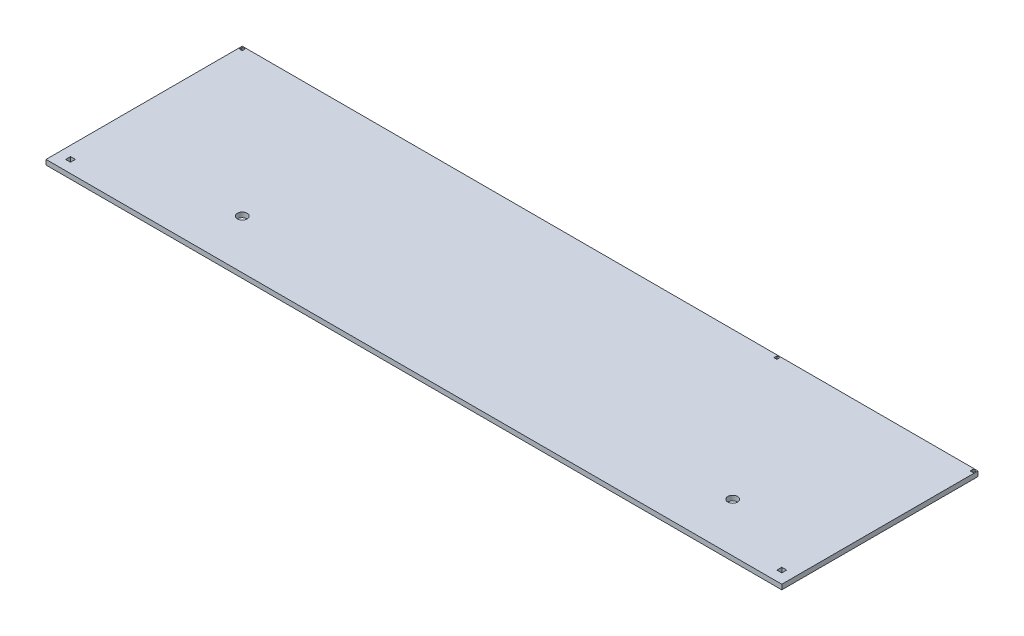
ISO-10303-21;
HEADER;
FILE_DESCRIPTION(('STEP AP214'),'2;1');
FILE_NAME('part.step','',(''),(''),'','','');
FILE_SCHEMA(('AUTOMOTIVE_DESIGN { 1 0 10303 214 1 1 1 1 }'));
ENDSEC;
DATA;
#1=APPLICATION_CONTEXT('core data for automotive mechanical design processes');
#2=APPLICATION_PROTOCOL_DEFINITION('international standard','automotive_design',2000,#1);
#3=PRODUCT_CONTEXT('',#1,'mechanical');
#4=PRODUCT('Part','Part','',(#3));
#5=PRODUCT_RELATED_PRODUCT_CATEGORY('part','',(#4));
#6=PRODUCT_DEFINITION_FORMATION('','',#4);
#7=PRODUCT_DEFINITION_CONTEXT('part definition',#1,'design');
#8=PRODUCT_DEFINITION('design','',#6,#7);
#9=PRODUCT_DEFINITION_SHAPE('','',#8);
#10=(LENGTH_UNIT() NAMED_UNIT(*) SI_UNIT(.MILLI.,.METRE.));
#11=(NAMED_UNIT(*) PLANE_ANGLE_UNIT() SI_UNIT($,.RADIAN.));
#12=(NAMED_UNIT(*) SI_UNIT($,.STERADIAN.) SOLID_ANGLE_UNIT());
#13=UNCERTAINTY_MEASURE_WITH_UNIT(LENGTH_MEASURE(1.E-05),#10,'distance_accuracy_value','');
#14=(GEOMETRIC_REPRESENTATION_CONTEXT(3) GLOBAL_UNCERTAINTY_ASSIGNED_CONTEXT((#13)) GLOBAL_UNIT_ASSIGNED_CONTEXT((#10,
#11,#12)) REPRESENTATION_CONTEXT('',''));
#15=CARTESIAN_POINT('',(0.,0.,0.));
#16=DIRECTION('',(0.,0.,1.));
#17=DIRECTION('',(1.,0.,0.));
#18=AXIS2_PLACEMENT_3D('',#15,#16,#17);
#19=CARTESIAN_POINT('',(-375.,305.,-25.));
#20=DIRECTION('',(0.,-1.,0.));
#21=DIRECTION('',(0.,0.,-1.));
#22=AXIS2_PLACEMENT_3D('',#19,#20,#21);
#23=PLANE('',#22);
#24=DIRECTION('',(0.,0.,-1.));
#25=VECTOR('',#24,1.);
#26=CARTESIAN_POINT('',(-371.,305.,-224.));
#27=LINE('',#26,#25);
#28=CARTESIAN_POINT('',(-371.,305.,-221.));
#29=VERTEX_POINT('',#28);
#30=CARTESIAN_POINT('',(-371.,305.,-224.));
#31=VERTEX_POINT('',#30);
#32=EDGE_CURVE('E209',#29,#31,#27,.T.);
#33=ORIENTED_EDGE('',*,*,#32,.T.);
#34=DIRECTION('',(-1.,0.,0.));
#35=VECTOR('',#34,1.);
#36=CARTESIAN_POINT('',(-374.,305.,-224.));
#37=LINE('',#36,#35);
#38=CARTESIAN_POINT('',(-374.,305.,-224.));
#39=VERTEX_POINT('',#38);
#40=EDGE_CURVE('E221',#31,#39,#37,.T.);
#41=ORIENTED_EDGE('',*,*,#40,.T.);
#42=DIRECTION('',(0.,0.,1.));
#43=VECTOR('',#42,1.);
#44=CARTESIAN_POINT('',(-374.,305.,-224.));
#45=LINE('',#44,#43);
#46=CARTESIAN_POINT('',(-374.,305.,-221.));
#47=VERTEX_POINT('',#46);
#48=EDGE_CURVE('E60',#39,#47,#45,.T.);
#49=ORIENTED_EDGE('',*,*,#48,.T.);
#50=DIRECTION('',(1.,0.,0.));
#51=VECTOR('',#50,1.);
#52=CARTESIAN_POINT('',(-374.,305.,-221.));
#53=LINE('',#52,#51);
#54=EDGE_CURVE('E218',#47,#29,#53,.T.);
#55=ORIENTED_EDGE('',*,*,#54,.T.);
#56=EDGE_LOOP('',(#33,#41,#49,#55));
#57=FACE_BOUND('',#56,.T.);
#58=DIRECTION('',(0.,0.,-1.));
#59=VECTOR('',#58,1.);
#60=CARTESIAN_POINT('',(374.,305.,-224.));
#61=LINE('',#60,#59);
#62=CARTESIAN_POINT('',(374.,305.,-221.));
#63=VERTEX_POINT('',#62);
#64=CARTESIAN_POINT('',(374.,305.,-224.));
#65=VERTEX_POINT('',#64);
#66=EDGE_CURVE('E277',#63,#65,#61,.T.);
#67=ORIENTED_EDGE('',*,*,#66,.T.);
#68=DIRECTION('',(-1.,0.,0.));
#69=VECTOR('',#68,1.);
#70=CARTESIAN_POINT('',(371.,305.,-224.));
#71=LINE('',#70,#69);
#72=CARTESIAN_POINT('',(371.,305.,-224.));
#73=VERTEX_POINT('',#72);
#74=EDGE_CURVE('E292',#65,#73,#71,.T.);
#75=ORIENTED_EDGE('',*,*,#74,.T.);
#76=DIRECTION('',(0.,0.,1.));
#77=VECTOR('',#76,1.);
#78=CARTESIAN_POINT('',(371.,305.,-224.));
#79=LINE('',#78,#77);
#80=CARTESIAN_POINT('',(371.,305.,-221.));
#81=VERTEX_POINT('',#80);
#82=EDGE_CURVE('E68',#73,#81,#79,.T.);
#83=ORIENTED_EDGE('',*,*,#82,.T.);
#84=DIRECTION('',(1.,0.,0.));
#85=VECTOR('',#84,1.);
#86=CARTESIAN_POINT('',(371.,305.,-221.));
#87=LINE('',#86,#85);
#88=EDGE_CURVE('E261',#81,#63,#87,.T.);
#89=ORIENTED_EDGE('',*,*,#88,.T.);
#90=EDGE_LOOP('',(#67,#75,#83,#89));
#91=FACE_BOUND('',#90,.T.);
#92=DIRECTION('',(0.,0.,-1.));
#93=VECTOR('',#92,1.);
#94=CARTESIAN_POINT('',(174.,305.,-224.));
#95=LINE('',#94,#93);
#96=CARTESIAN_POINT('',(174.,305.,-221.));
#97=VERTEX_POINT('',#96);
#98=CARTESIAN_POINT('',(174.,305.,-224.));
#99=VERTEX_POINT('',#98);
#100=EDGE_CURVE('E318',#97,#99,#95,.T.);
#101=ORIENTED_EDGE('',*,*,#100,.T.);
#102=DIRECTION('',(-1.,0.,0.));
#103=VECTOR('',#102,1.);
#104=CARTESIAN_POINT('',(171.,305.,-224.));
#105=LINE('',#104,#103);
#106=CARTESIAN_POINT('',(171.,305.,-224.));
#107=VERTEX_POINT('',#106);
#108=EDGE_CURVE('E335',#99,#107,#105,.T.);
#109=ORIENTED_EDGE('',*,*,#108,.T.);
#110=DIRECTION('',(0.,0.,1.));
#111=VECTOR('',#110,1.);
#112=CARTESIAN_POINT('',(171.,305.,-224.));
#113=LINE('',#112,#111);
#114=CARTESIAN_POINT('',(171.,305.,-221.));
#115=VERTEX_POINT('',#114);
#116=EDGE_CURVE('E331',#107,#115,#113,.T.);
#117=ORIENTED_EDGE('',*,*,#116,.T.);
#118=DIRECTION('',(1.,0.,0.));
#119=VECTOR('',#118,1.);
#120=CARTESIAN_POINT('',(171.,305.,-221.));
#121=LINE('',#120,#119);
#122=EDGE_CURVE('E303',#115,#97,#121,.T.);
#123=ORIENTED_EDGE('',*,*,#122,.T.);
#124=EDGE_LOOP('',(#101,#109,#117,#123));
#125=FACE_BOUND('',#124,.T.);
#126=DIRECTION('',(1.,0.,0.));
#127=VECTOR('',#126,1.);
#128=CARTESIAN_POINT('',(-375.,305.,-225.));
#129=LINE('',#128,#127);
#130=CARTESIAN_POINT('',(-375.,305.,-225.));
#131=VERTEX_POINT('',#130);
#132=CARTESIAN_POINT('',(375.,305.,-225.));
#133=VERTEX_POINT('',#132);
#134=EDGE_CURVE('E46',#131,#133,#129,.T.);
#135=ORIENTED_EDGE('',*,*,#134,.T.);
#136=DIRECTION('',(0.,0.,1.));
#137=VECTOR('',#136,1.);
#138=CARTESIAN_POINT('',(375.,305.,-220.));
#139=LINE('',#138,#137);
#140=CARTESIAN_POINT('',(375.,305.,-25.0000000000001));
#141=VERTEX_POINT('',#140);
#142=EDGE_CURVE('E401',#133,#141,#139,.T.);
#143=ORIENTED_EDGE('',*,*,#142,.T.);
#144=DIRECTION('',(1.,0.,0.));
#145=VECTOR('',#144,1.);
#146=CARTESIAN_POINT('',(-375.,305.,-25.));
#147=LINE('',#146,#145);
#148=CARTESIAN_POINT('',(-375.,305.,-25.));
#149=VERTEX_POINT('',#148);
#150=EDGE_CURVE('E374',#149,#141,#147,.T.);
#151=ORIENTED_EDGE('',*,*,#150,.F.);
#152=DIRECTION('',(0.,0.,1.));
#153=VECTOR('',#152,1.);
#154=CARTESIAN_POINT('',(-375.,305.,-220.));
#155=LINE('',#154,#153);
#156=EDGE_CURVE('E400',#131,#149,#155,.T.);
#157=ORIENTED_EDGE('',*,*,#156,.F.);
#158=EDGE_LOOP('',(#135,#143,#151,#157));
#159=FACE_BOUND('',#158,.T.);
#160=DIRECTION('',(-1.,0.,0.));
#161=VECTOR('',#160,1.);
#162=CARTESIAN_POINT('',(-375.,305.,-40.0000000000001));
#163=LINE('',#162,#161);
#164=CARTESIAN_POINT('',(-360.,305.,-40.0000000000001));
#165=VERTEX_POINT('',#164);
#166=CARTESIAN_POINT('',(-365.,305.,-40.0000000000001));
#167=VERTEX_POINT('',#166);
#168=EDGE_CURVE('E346',#165,#167,#163,.T.);
#169=ORIENTED_EDGE('',*,*,#168,.T.);
#170=DIRECTION('',(0.,0.,1.));
#171=VECTOR('',#170,1.);
#172=CARTESIAN_POINT('',(-364.999999999998,305.,-220.));
#173=LINE('',#172,#171);
#174=CARTESIAN_POINT('',(-365.,305.,-35.0000000000001));
#175=VERTEX_POINT('',#174);
#176=EDGE_CURVE('E342',#167,#175,#173,.T.);
#177=ORIENTED_EDGE('',*,*,#176,.T.);
#178=DIRECTION('',(1.,0.,0.));
#179=VECTOR('',#178,1.);
#180=CARTESIAN_POINT('',(-375.,305.,-35.0000000000001));
#181=LINE('',#180,#179);
#182=CARTESIAN_POINT('',(-360.,305.,-35.0000000000001));
#183=VERTEX_POINT('',#182);
#184=EDGE_CURVE('E354',#175,#183,#181,.T.);
#185=ORIENTED_EDGE('',*,*,#184,.T.);
#186=DIRECTION('',(0.,0.,-1.));
#187=VECTOR('',#186,1.);
#188=CARTESIAN_POINT('',(-360.,305.,-220.));
#189=LINE('',#188,#187);
#190=EDGE_CURVE('E350',#183,#165,#189,.T.);
#191=ORIENTED_EDGE('',*,*,#190,.T.);
#192=EDGE_LOOP('',(#169,#177,#185,#191));
#193=FACE_BOUND('',#192,.T.);
#194=DIRECTION('',(-1.,0.,0.));
#195=VECTOR('',#194,1.);
#196=CARTESIAN_POINT('',(-375.,305.,-40.0000000000001));
#197=LINE('',#196,#195);
#198=CARTESIAN_POINT('',(365.,305.,-40.0000000000001));
#199=VERTEX_POINT('',#198);
#200=CARTESIAN_POINT('',(360.,305.,-40.0000000000001));
#201=VERTEX_POINT('',#200);
#202=EDGE_CURVE('E362',#199,#201,#197,.T.);
#203=ORIENTED_EDGE('',*,*,#202,.T.);
#204=DIRECTION('',(0.,0.,1.));
#205=VECTOR('',#204,1.);
#206=CARTESIAN_POINT('',(360.,305.,-220.));
#207=LINE('',#206,#205);
#208=CARTESIAN_POINT('',(360.,305.,-35.0000000000001));
#209=VERTEX_POINT('',#208);
#210=EDGE_CURVE('E358',#201,#209,#207,.T.);
#211=ORIENTED_EDGE('',*,*,#210,.T.);
#212=DIRECTION('',(1.,0.,0.));
#213=VECTOR('',#212,1.);
#214=CARTESIAN_POINT('',(-375.,305.,-35.0000000000001));
#215=LINE('',#214,#213);
#216=CARTESIAN_POINT('',(365.,305.,-35.0000000000001));
#217=VERTEX_POINT('',#216);
#218=EDGE_CURVE('E370',#209,#217,#215,.T.);
#219=ORIENTED_EDGE('',*,*,#218,.T.);
#220=DIRECTION('',(0.,0.,-1.));
#221=VECTOR('',#220,1.);
#222=CARTESIAN_POINT('',(365.,305.,-220.));
#223=LINE('',#222,#221);
#224=EDGE_CURVE('E366',#217,#199,#223,.T.);
#225=ORIENTED_EDGE('',*,*,#224,.T.);
#226=EDGE_LOOP('',(#203,#211,#219,#225));
#227=FACE_BOUND('',#226,.T.);
#228=CARTESIAN_POINT('',(-225.,305.,-75.));
#229=DIRECTION('',(0.,1.,0.));
#230=DIRECTION('',(0.,0.,1.));
#231=AXIS2_PLACEMENT_3D('',#228,#229,#230);
#232=CIRCLE('',#231,4.99999999999999);
#233=CARTESIAN_POINT('',(-225.,305.,-80.));
#234=VERTEX_POINT('',#233);
#235=EDGE_CURVE('E378',#234,#234,#232,.F.);
#236=ORIENTED_EDGE('',*,*,#235,.F.);
#237=EDGE_LOOP('',(#236));
#238=FACE_BOUND('',#237,.T.);
#239=CARTESIAN_POINT('',(275.,305.,-75.));
#240=DIRECTION('',(0.,1.,0.));
#241=DIRECTION('',(0.,0.,1.));
#242=AXIS2_PLACEMENT_3D('',#239,#240,#241);
#243=CIRCLE('',#242,4.99999999999999);
#244=CARTESIAN_POINT('',(275.,305.,-80.));
#245=VERTEX_POINT('',#244);
#246=EDGE_CURVE('E384',#245,#245,#243,.F.);
#247=ORIENTED_EDGE('',*,*,#246,.F.);
#248=EDGE_LOOP('',(#247));
#249=FACE_BOUND('',#248,.T.);
#250=ADVANCED_FACE('F42',(#57,#91,#125,#159,#193,#227,#238,#249),#23,.T.);
#251=CARTESIAN_POINT('',(-375.,310.,-225.));
#252=DIRECTION('',(0.,0.,1.));
#253=DIRECTION('',(1.,0.,0.));
#254=AXIS2_PLACEMENT_3D('',#251,#252,#253);
#255=PLANE('',#254);
#256=ORIENTED_EDGE('',*,*,#134,.F.);
#257=DIRECTION('',(0.,-1.,0.));
#258=VECTOR('',#257,1.);
#259=CARTESIAN_POINT('',(-375.,310.,-225.));
#260=LINE('',#259,#258);
#261=CARTESIAN_POINT('',(-375.,310.,-225.));
#262=VERTEX_POINT('',#261);
#263=EDGE_CURVE('E394',#262,#131,#260,.T.);
#264=ORIENTED_EDGE('',*,*,#263,.F.);
#265=DIRECTION('',(-1.,0.,0.));
#266=VECTOR('',#265,1.);
#267=CARTESIAN_POINT('',(-375.,310.,-225.));
#268=LINE('',#267,#266);
#269=CARTESIAN_POINT('',(375.,310.,-225.));
#270=VERTEX_POINT('',#269);
#271=EDGE_CURVE('E393',#270,#262,#268,.T.);
#272=ORIENTED_EDGE('',*,*,#271,.F.);
#273=DIRECTION('',(0.,-1.,0.));
#274=VECTOR('',#273,1.);
#275=CARTESIAN_POINT('',(375.,310.,-225.));
#276=LINE('',#275,#274);
#277=EDGE_CURVE('E377',#270,#133,#276,.T.);
#278=ORIENTED_EDGE('',*,*,#277,.T.);
#279=EDGE_LOOP('',(#256,#264,#272,#278));
#280=FACE_BOUND('',#279,.T.);
#281=ADVANCED_FACE('F44',(#280),#255,.F.);
#282=CARTESIAN_POINT('',(365.,0.,-40.0000000000001));
#283=DIRECTION('',(1.,0.,0.));
#284=DIRECTION('',(0.,0.,-1.));
#285=AXIS2_PLACEMENT_3D('',#282,#283,#284);
#286=PLANE('',#285);
#287=DIRECTION('',(0.,1.,0.));
#288=VECTOR('',#287,1.);
#289=CARTESIAN_POINT('',(365.,0.,-35.0000000000001));
#290=LINE('',#289,#288);
#291=CARTESIAN_POINT('',(365.,310.,-35.0000000000001));
#292=VERTEX_POINT('',#291);
#293=EDGE_CURVE('E471',#217,#292,#290,.T.);
#294=ORIENTED_EDGE('',*,*,#293,.T.);
#295=DIRECTION('',(0.,0.,-1.));
#296=VECTOR('',#295,1.);
#297=CARTESIAN_POINT('',(365.,310.,-40.0000000000001));
#298=LINE('',#297,#296);
#299=CARTESIAN_POINT('',(365.,310.,-40.0000000000001));
#300=VERTEX_POINT('',#299);
#301=EDGE_CURVE('E433',#292,#300,#298,.T.);
#302=ORIENTED_EDGE('',*,*,#301,.T.);
#303=DIRECTION('',(0.,1.,0.));
#304=VECTOR('',#303,1.);
#305=CARTESIAN_POINT('',(365.,0.,-40.0000000000001));
#306=LINE('',#305,#304);
#307=EDGE_CURVE('E52',#199,#300,#306,.T.);
#308=ORIENTED_EDGE('',*,*,#307,.F.);
#309=ORIENTED_EDGE('',*,*,#224,.F.);
#310=EDGE_LOOP('',(#294,#302,#308,#309));
#311=FACE_BOUND('',#310,.T.);
#312=ADVANCED_FACE('F513',(#311),#286,.F.);
#313=CARTESIAN_POINT('',(360.,0.,-35.0000000000001));
#314=DIRECTION('',(0.,0.,1.));
#315=DIRECTION('',(1.,0.,0.));
#316=AXIS2_PLACEMENT_3D('',#313,#314,#315);
#317=PLANE('',#316);
#318=DIRECTION('',(0.,1.,0.));
#319=VECTOR('',#318,1.);
#320=CARTESIAN_POINT('',(360.,0.,-35.0000000000001));
#321=LINE('',#320,#319);
#322=CARTESIAN_POINT('',(360.,310.,-35.0000000000001));
#323=VERTEX_POINT('',#322);
#324=EDGE_CURVE('E441',#209,#323,#321,.T.);
#325=ORIENTED_EDGE('',*,*,#324,.T.);
#326=DIRECTION('',(1.,0.,0.));
#327=VECTOR('',#326,1.);
#328=CARTESIAN_POINT('',(360.,310.,-35.0000000000001));
#329=LINE('',#328,#327);
#330=EDGE_CURVE('E428',#323,#292,#329,.T.);
#331=ORIENTED_EDGE('',*,*,#330,.T.);
#332=ORIENTED_EDGE('',*,*,#293,.F.);
#333=ORIENTED_EDGE('',*,*,#218,.F.);
#334=EDGE_LOOP('',(#325,#331,#332,#333));
#335=FACE_BOUND('',#334,.T.);
#336=ADVANCED_FACE('F518',(#335),#317,.F.);
#337=CARTESIAN_POINT('',(-360.,0.,-40.0000000000001));
#338=DIRECTION('',(1.,0.,0.));
#339=DIRECTION('',(0.,0.,-1.));
#340=AXIS2_PLACEMENT_3D('',#337,#338,#339);
#341=PLANE('',#340);
#342=DIRECTION('',(0.,1.,0.));
#343=VECTOR('',#342,1.);
#344=CARTESIAN_POINT('',(-360.,0.,-35.0000000000001));
#345=LINE('',#344,#343);
#346=CARTESIAN_POINT('',(-360.,310.,-35.0000000000001));
#347=VERTEX_POINT('',#346);
#348=EDGE_CURVE('E462',#183,#347,#345,.T.);
#349=ORIENTED_EDGE('',*,*,#348,.T.);
#350=DIRECTION('',(0.,0.,-1.));
#351=VECTOR('',#350,1.);
#352=CARTESIAN_POINT('',(-360.,310.,-40.0000000000001));
#353=LINE('',#352,#351);
#354=CARTESIAN_POINT('',(-360.,310.,-40.0000000000001));
#355=VERTEX_POINT('',#354);
#356=EDGE_CURVE('E446',#347,#355,#353,.T.);
#357=ORIENTED_EDGE('',*,*,#356,.T.);
#358=DIRECTION('',(0.,1.,0.));
#359=VECTOR('',#358,1.);
#360=CARTESIAN_POINT('',(-360.,0.,-40.0000000000001));
#361=LINE('',#360,#359);
#362=EDGE_CURVE('E459',#165,#355,#361,.T.);
#363=ORIENTED_EDGE('',*,*,#362,.F.);
#364=ORIENTED_EDGE('',*,*,#190,.F.);
#365=EDGE_LOOP('',(#349,#357,#363,#364));
#366=FACE_BOUND('',#365,.T.);
#367=ADVANCED_FACE('F632',(#366),#341,.F.);
#368=CARTESIAN_POINT('',(-365.,0.,-35.0000000000001));
#369=DIRECTION('',(0.,0.,1.));
#370=DIRECTION('',(1.,0.,0.));
#371=AXIS2_PLACEMENT_3D('',#368,#369,#370);
#372=PLANE('',#371);
#373=DIRECTION('',(0.,1.,0.));
#374=VECTOR('',#373,1.);
#375=CARTESIAN_POINT('',(-365.,0.,-35.0000000000001));
#376=LINE('',#375,#374);
#377=CARTESIAN_POINT('',(-365.,310.,-35.0000000000001));
#378=VERTEX_POINT('',#377);
#379=EDGE_CURVE('E447',#175,#378,#376,.T.);
#380=ORIENTED_EDGE('',*,*,#379,.T.);
#381=DIRECTION('',(1.,0.,0.));
#382=VECTOR('',#381,1.);
#383=CARTESIAN_POINT('',(-365.,310.,-35.0000000000001));
#384=LINE('',#383,#382);
#385=EDGE_CURVE('E451',#378,#347,#384,.T.);
#386=ORIENTED_EDGE('',*,*,#385,.T.);
#387=ORIENTED_EDGE('',*,*,#348,.F.);
#388=ORIENTED_EDGE('',*,*,#184,.F.);
#389=EDGE_LOOP('',(#380,#386,#387,#388));
#390=FACE_BOUND('',#389,.T.);
#391=ADVANCED_FACE('F541',(#390),#372,.F.);
#392=CARTESIAN_POINT('',(0.,310.,0.));
#393=DIRECTION('',(0.,1.,0.));
#394=DIRECTION('',(0.,0.,1.));
#395=AXIS2_PLACEMENT_3D('',#392,#393,#394);
#396=PLANE('',#395);
#397=DIRECTION('',(0.,0.,-1.));
#398=VECTOR('',#397,1.);
#399=CARTESIAN_POINT('',(-371.,310.,-224.));
#400=LINE('',#399,#398);
#401=CARTESIAN_POINT('',(-371.,310.,-221.));
#402=VERTEX_POINT('',#401);
#403=CARTESIAN_POINT('',(-371.,310.,-224.));
#404=VERTEX_POINT('',#403);
#405=EDGE_CURVE('E212',#402,#404,#400,.T.);
#406=ORIENTED_EDGE('',*,*,#405,.F.);
#407=DIRECTION('',(1.,0.,0.));
#408=VECTOR('',#407,1.);
#409=CARTESIAN_POINT('',(-374.,310.,-221.));
#410=LINE('',#409,#408);
#411=CARTESIAN_POINT('',(-374.,310.,-221.));
#412=VERTEX_POINT('',#411);
#413=EDGE_CURVE('E229',#412,#402,#410,.T.);
#414=ORIENTED_EDGE('',*,*,#413,.F.);
#415=DIRECTION('',(0.,0.,1.));
#416=VECTOR('',#415,1.);
#417=CARTESIAN_POINT('',(-374.,310.,-224.));
#418=LINE('',#417,#416);
#419=CARTESIAN_POINT('',(-374.,310.,-224.));
#420=VERTEX_POINT('',#419);
#421=EDGE_CURVE('E233',#420,#412,#418,.T.);
#422=ORIENTED_EDGE('',*,*,#421,.F.);
#423=DIRECTION('',(-1.,0.,0.));
#424=VECTOR('',#423,1.);
#425=CARTESIAN_POINT('',(-374.,310.,-224.));
#426=LINE('',#425,#424);
#427=EDGE_CURVE('E242',#404,#420,#426,.T.);
#428=ORIENTED_EDGE('',*,*,#427,.F.);
#429=EDGE_LOOP('',(#406,#414,#422,#428));
#430=FACE_BOUND('',#429,.T.);
#431=DIRECTION('',(0.,0.,-1.));
#432=VECTOR('',#431,1.);
#433=CARTESIAN_POINT('',(374.,310.,-224.));
#434=LINE('',#433,#432);
#435=CARTESIAN_POINT('',(374.,310.,-221.));
#436=VERTEX_POINT('',#435);
#437=CARTESIAN_POINT('',(374.,310.,-224.));
#438=VERTEX_POINT('',#437);
#439=EDGE_CURVE('E243',#436,#438,#434,.T.);
#440=ORIENTED_EDGE('',*,*,#439,.F.);
#441=DIRECTION('',(1.,0.,0.));
#442=VECTOR('',#441,1.);
#443=CARTESIAN_POINT('',(371.,310.,-221.));
#444=LINE('',#443,#442);
#445=CARTESIAN_POINT('',(371.,310.,-221.));
#446=VERTEX_POINT('',#445);
#447=EDGE_CURVE('E272',#446,#436,#444,.T.);
#448=ORIENTED_EDGE('',*,*,#447,.F.);
#449=DIRECTION('',(0.,0.,1.));
#450=VECTOR('',#449,1.);
#451=CARTESIAN_POINT('',(371.,310.,-224.));
#452=LINE('',#451,#450);
#453=CARTESIAN_POINT('',(371.,310.,-224.));
#454=VERTEX_POINT('',#453);
#455=EDGE_CURVE('E276',#454,#446,#452,.T.);
#456=ORIENTED_EDGE('',*,*,#455,.F.);
#457=DIRECTION('',(-1.,0.,0.));
#458=VECTOR('',#457,1.);
#459=CARTESIAN_POINT('',(371.,310.,-224.));
#460=LINE('',#459,#458);
#461=EDGE_CURVE('E281',#438,#454,#460,.T.);
#462=ORIENTED_EDGE('',*,*,#461,.F.);
#463=EDGE_LOOP('',(#440,#448,#456,#462));
#464=FACE_BOUND('',#463,.T.);
#465=DIRECTION('',(0.,0.,-1.));
#466=VECTOR('',#465,1.);
#467=CARTESIAN_POINT('',(174.,310.,-224.));
#468=LINE('',#467,#466);
#469=CARTESIAN_POINT('',(174.,310.,-221.));
#470=VERTEX_POINT('',#469);
#471=CARTESIAN_POINT('',(174.,310.,-224.));
#472=VERTEX_POINT('',#471);
#473=EDGE_CURVE('E271',#470,#472,#468,.T.);
#474=ORIENTED_EDGE('',*,*,#473,.F.);
#475=DIRECTION('',(1.,0.,0.));
#476=VECTOR('',#475,1.);
#477=CARTESIAN_POINT('',(171.,310.,-221.));
#478=LINE('',#477,#476);
#479=CARTESIAN_POINT('',(171.,310.,-221.));
#480=VERTEX_POINT('',#479);
#481=EDGE_CURVE('E313',#480,#470,#478,.T.);
#482=ORIENTED_EDGE('',*,*,#481,.F.);
#483=DIRECTION('',(0.,0.,1.));
#484=VECTOR('',#483,1.);
#485=CARTESIAN_POINT('',(171.,310.,-224.));
#486=LINE('',#485,#484);
#487=CARTESIAN_POINT('',(171.,310.,-224.));
#488=VERTEX_POINT('',#487);
#489=EDGE_CURVE('E317',#488,#480,#486,.T.);
#490=ORIENTED_EDGE('',*,*,#489,.F.);
#491=DIRECTION('',(-1.,0.,0.));
#492=VECTOR('',#491,1.);
#493=CARTESIAN_POINT('',(171.,310.,-224.));
#494=LINE('',#493,#492);
#495=EDGE_CURVE('E322',#472,#488,#494,.T.);
#496=ORIENTED_EDGE('',*,*,#495,.F.);
#497=EDGE_LOOP('',(#474,#482,#490,#496));
#498=FACE_BOUND('',#497,.T.);
#499=DIRECTION('',(0.,0.,1.));
#500=VECTOR('',#499,1.);
#501=CARTESIAN_POINT('',(-365.,310.,-40.0000000000001));
#502=LINE('',#501,#500);
#503=CARTESIAN_POINT('',(-365.,310.,-40.0000000000001));
#504=VERTEX_POINT('',#503);
#505=EDGE_CURVE('E429',#504,#378,#502,.T.);
#506=ORIENTED_EDGE('',*,*,#505,.F.);
#507=DIRECTION('',(-1.,0.,0.));
#508=VECTOR('',#507,1.);
#509=CARTESIAN_POINT('',(-365.,310.,-40.0000000000001));
#510=LINE('',#509,#508);
#511=EDGE_CURVE('E442',#355,#504,#510,.T.);
#512=ORIENTED_EDGE('',*,*,#511,.F.);
#513=ORIENTED_EDGE('',*,*,#356,.F.);
#514=ORIENTED_EDGE('',*,*,#385,.F.);
#515=EDGE_LOOP('',(#506,#512,#513,#514));
#516=FACE_BOUND('',#515,.T.);
#517=DIRECTION('',(0.,0.,1.));
#518=VECTOR('',#517,1.);
#519=CARTESIAN_POINT('',(360.,310.,-40.0000000000001));
#520=LINE('',#519,#518);
#521=CARTESIAN_POINT('',(360.,310.,-40.0000000000001));
#522=VERTEX_POINT('',#521);
#523=EDGE_CURVE('E425',#522,#323,#520,.T.);
#524=ORIENTED_EDGE('',*,*,#523,.F.);
#525=DIRECTION('',(-1.,0.,0.));
#526=VECTOR('',#525,1.);
#527=CARTESIAN_POINT('',(360.,310.,-40.0000000000001));
#528=LINE('',#527,#526);
#529=EDGE_CURVE('E437',#300,#522,#528,.T.);
#530=ORIENTED_EDGE('',*,*,#529,.F.);
#531=ORIENTED_EDGE('',*,*,#301,.F.);
#532=ORIENTED_EDGE('',*,*,#330,.F.);
#533=EDGE_LOOP('',(#524,#530,#531,#532));
#534=FACE_BOUND('',#533,.T.);
#535=CARTESIAN_POINT('',(-225.,310.,-75.));
#536=DIRECTION('',(0.,1.,0.));
#537=DIRECTION('',(0.,0.,1.));
#538=AXIS2_PLACEMENT_3D('',#535,#536,#537);
#539=CIRCLE('',#538,4.99999999999999);
#540=CARTESIAN_POINT('',(-225.,310.,-80.));
#541=VERTEX_POINT('',#540);
#542=EDGE_CURVE('E383',#541,#541,#539,.F.);
#543=ORIENTED_EDGE('',*,*,#542,.T.);
#544=EDGE_LOOP('',(#543));
#545=FACE_BOUND('',#544,.T.);
#546=CARTESIAN_POINT('',(275.,310.,-75.));
#547=DIRECTION('',(0.,1.,0.));
#548=DIRECTION('',(0.,0.,1.));
#549=AXIS2_PLACEMENT_3D('',#546,#547,#548);
#550=CIRCLE('',#549,4.99999999999999);
#551=CARTESIAN_POINT('',(275.,310.,-80.));
#552=VERTEX_POINT('',#551);
#553=EDGE_CURVE('E382',#552,#552,#550,.F.);
#554=ORIENTED_EDGE('',*,*,#553,.T.);
#555=EDGE_LOOP('',(#554));
#556=FACE_BOUND('',#555,.T.);
#557=DIRECTION('',(0.,0.,1.));
#558=VECTOR('',#557,1.);
#559=CARTESIAN_POINT('',(-375.,310.,-225.));
#560=LINE('',#559,#558);
#561=CARTESIAN_POINT('',(-375.,310.,-25.));
#562=VERTEX_POINT('',#561);
#563=EDGE_CURVE('E389',#262,#562,#560,.T.);
#564=ORIENTED_EDGE('',*,*,#563,.T.);
#565=DIRECTION('',(1.,0.,0.));
#566=VECTOR('',#565,1.);
#567=CARTESIAN_POINT('',(0.,310.,-25.));
#568=LINE('',#567,#566);
#569=CARTESIAN_POINT('',(375.,310.,-25.0000000000001));
#570=VERTEX_POINT('',#569);
#571=EDGE_CURVE('E405',#562,#570,#568,.T.);
#572=ORIENTED_EDGE('',*,*,#571,.T.);
#573=DIRECTION('',(0.,0.,-1.));
#574=VECTOR('',#573,1.);
#575=CARTESIAN_POINT('',(375.,310.,-225.));
#576=LINE('',#575,#574);
#577=EDGE_CURVE('E397',#570,#270,#576,.T.);
#578=ORIENTED_EDGE('',*,*,#577,.T.);
#579=ORIENTED_EDGE('',*,*,#271,.T.);
#580=EDGE_LOOP('',(#564,#572,#578,#579));
#581=FACE_BOUND('',#580,.T.);
#582=ADVANCED_FACE('F497',(#430,#464,#498,#516,#534,#545,#556,#581),#396,.T.);
#583=CARTESIAN_POINT('',(-365.,0.,-40.0000000000001));
#584=DIRECTION('',(0.,0.,-1.));
#585=DIRECTION('',(-1.,0.,0.));
#586=AXIS2_PLACEMENT_3D('',#583,#584,#585);
#587=PLANE('',#586);
#588=ORIENTED_EDGE('',*,*,#362,.T.);
#589=ORIENTED_EDGE('',*,*,#511,.T.);
#590=DIRECTION('',(0.,1.,0.));
#591=VECTOR('',#590,1.);
#592=CARTESIAN_POINT('',(-365.,0.,-40.0000000000001));
#593=LINE('',#592,#591);
#594=EDGE_CURVE('E424',#167,#504,#593,.T.);
#595=ORIENTED_EDGE('',*,*,#594,.F.);
#596=ORIENTED_EDGE('',*,*,#168,.F.);
#597=EDGE_LOOP('',(#588,#589,#595,#596));
#598=FACE_BOUND('',#597,.T.);
#599=ADVANCED_FACE('F540',(#598),#587,.F.);
#600=CARTESIAN_POINT('',(-365.,0.,-40.0000000000001));
#601=DIRECTION('',(-1.,0.,0.));
#602=DIRECTION('',(0.,0.,1.));
#603=AXIS2_PLACEMENT_3D('',#600,#601,#602);
#604=PLANE('',#603);
#605=ORIENTED_EDGE('',*,*,#594,.T.);
#606=ORIENTED_EDGE('',*,*,#505,.T.);
#607=ORIENTED_EDGE('',*,*,#379,.F.);
#608=ORIENTED_EDGE('',*,*,#176,.F.);
#609=EDGE_LOOP('',(#605,#606,#607,#608));
#610=FACE_BOUND('',#609,.T.);
#611=ADVANCED_FACE('F619',(#610),#604,.F.);
#612=CARTESIAN_POINT('',(360.,0.,-40.0000000000001));
#613=DIRECTION('',(0.,0.,-1.));
#614=DIRECTION('',(-1.,0.,0.));
#615=AXIS2_PLACEMENT_3D('',#612,#613,#614);
#616=PLANE('',#615);
#617=ORIENTED_EDGE('',*,*,#307,.T.);
#618=ORIENTED_EDGE('',*,*,#529,.T.);
#619=DIRECTION('',(0.,1.,0.));
#620=VECTOR('',#619,1.);
#621=CARTESIAN_POINT('',(360.,0.,-40.0000000000001));
#622=LINE('',#621,#620);
#623=EDGE_CURVE('E11',#201,#522,#622,.T.);
#624=ORIENTED_EDGE('',*,*,#623,.F.);
#625=ORIENTED_EDGE('',*,*,#202,.F.);
#626=EDGE_LOOP('',(#617,#618,#624,#625));
#627=FACE_BOUND('',#626,.T.);
#628=ADVANCED_FACE('F616',(#627),#616,.F.);
#629=CARTESIAN_POINT('',(360.,0.,-40.0000000000001));
#630=DIRECTION('',(-1.,0.,0.));
#631=DIRECTION('',(0.,0.,1.));
#632=AXIS2_PLACEMENT_3D('',#629,#630,#631);
#633=PLANE('',#632);
#634=ORIENTED_EDGE('',*,*,#623,.T.);
#635=ORIENTED_EDGE('',*,*,#523,.T.);
#636=ORIENTED_EDGE('',*,*,#324,.F.);
#637=ORIENTED_EDGE('',*,*,#210,.F.);
#638=EDGE_LOOP('',(#634,#635,#636,#637));
#639=FACE_BOUND('',#638,.T.);
#640=ADVANCED_FACE('F610',(#639),#633,.F.);
#641=CARTESIAN_POINT('',(375.,310.,-225.));
#642=DIRECTION('',(-1.,0.,0.));
#643=DIRECTION('',(0.,0.,1.));
#644=AXIS2_PLACEMENT_3D('',#641,#642,#643);
#645=PLANE('',#644);
#646=ORIENTED_EDGE('',*,*,#142,.F.);
#647=ORIENTED_EDGE('',*,*,#277,.F.);
#648=ORIENTED_EDGE('',*,*,#577,.F.);
#649=DIRECTION('',(0.,-1.,0.));
#650=VECTOR('',#649,1.);
#651=CARTESIAN_POINT('',(375.,310.000012,-25.0000000000001));
#652=LINE('',#651,#650);
#653=EDGE_CURVE('E420',#570,#141,#652,.T.);
#654=ORIENTED_EDGE('',*,*,#653,.T.);
#655=EDGE_LOOP('',(#646,#647,#648,#654));
#656=FACE_BOUND('',#655,.T.);
#657=ADVANCED_FACE('F498',(#656),#645,.F.);
#658=CARTESIAN_POINT('',(-375.,310.,-225.));
#659=DIRECTION('',(1.,0.,0.));
#660=DIRECTION('',(0.,0.,-1.));
#661=AXIS2_PLACEMENT_3D('',#658,#659,#660);
#662=PLANE('',#661);
#663=ORIENTED_EDGE('',*,*,#263,.T.);
#664=ORIENTED_EDGE('',*,*,#156,.T.);
#665=DIRECTION('',(0.,-1.,0.));
#666=VECTOR('',#665,1.);
#667=CARTESIAN_POINT('',(-375.,310.000012,-25.));
#668=LINE('',#667,#666);
#669=EDGE_CURVE('E388',#562,#149,#668,.T.);
#670=ORIENTED_EDGE('',*,*,#669,.F.);
#671=ORIENTED_EDGE('',*,*,#563,.F.);
#672=EDGE_LOOP('',(#663,#664,#670,#671));
#673=FACE_BOUND('',#672,.T.);
#674=ADVANCED_FACE('F495',(#673),#662,.F.);
#675=CARTESIAN_POINT('',(375.,310.000012,-25.0000000000001));
#676=DIRECTION('',(0.,0.,1.));
#677=DIRECTION('',(1.,0.,0.));
#678=AXIS2_PLACEMENT_3D('',#675,#676,#677);
#679=PLANE('',#678);
#680=ORIENTED_EDGE('',*,*,#669,.T.);
#681=ORIENTED_EDGE('',*,*,#150,.T.);
#682=ORIENTED_EDGE('',*,*,#653,.F.);
#683=ORIENTED_EDGE('',*,*,#571,.F.);
#684=EDGE_LOOP('',(#680,#681,#682,#683));
#685=FACE_BOUND('',#684,.T.);
#686=ADVANCED_FACE('F500',(#685),#679,.T.);
#687=CARTESIAN_POINT('',(-225.,310.000012,-75.));
#688=DIRECTION('',(0.,-1.,0.));
#689=DIRECTION('',(0.,0.,-1.));
#690=AXIS2_PLACEMENT_3D('',#687,#688,#689);
#691=CYLINDRICAL_SURFACE('',#690,4.99999999999999);
#692=CARTESIAN_POINT('',(-225.,310.,-80.));
#693=CARTESIAN_POINT('',(-225.,309.947916666667,-80.));
#694=CARTESIAN_POINT('',(-225.,309.895833333333,-80.));
#695=CARTESIAN_POINT('',(-225.,309.791666666667,-80.));
#696=CARTESIAN_POINT('',(-225.,309.739583333333,-80.));
#697=CARTESIAN_POINT('',(-225.,309.635416666667,-80.));
#698=CARTESIAN_POINT('',(-225.,309.583333333333,-80.));
#699=CARTESIAN_POINT('',(-225.,309.479166666667,-80.));
#700=CARTESIAN_POINT('',(-225.,309.427083333333,-80.));
#701=CARTESIAN_POINT('',(-225.,309.322916666667,-80.));
#702=CARTESIAN_POINT('',(-225.,309.270833333333,-80.));
#703=CARTESIAN_POINT('',(-225.,309.166666666667,-80.));
#704=CARTESIAN_POINT('',(-225.,309.114583333333,-80.));
#705=CARTESIAN_POINT('',(-225.,309.010416666667,-80.));
#706=CARTESIAN_POINT('',(-225.,308.958333333333,-80.));
#707=CARTESIAN_POINT('',(-225.,308.854166666667,-80.));
#708=CARTESIAN_POINT('',(-225.,308.802083333333,-80.));
#709=CARTESIAN_POINT('',(-225.,308.697916666667,-80.));
#710=CARTESIAN_POINT('',(-225.,308.645833333333,-80.));
#711=CARTESIAN_POINT('',(-225.,308.541666666667,-80.));
#712=CARTESIAN_POINT('',(-225.,308.489583333333,-80.));
#713=CARTESIAN_POINT('',(-225.,308.385416666667,-80.));
#714=CARTESIAN_POINT('',(-225.,308.333333333333,-80.));
#715=CARTESIAN_POINT('',(-225.,308.229166666667,-80.));
#716=CARTESIAN_POINT('',(-225.,308.177083333333,-80.));
#717=CARTESIAN_POINT('',(-225.,308.072916666667,-80.));
#718=CARTESIAN_POINT('',(-225.,308.020833333333,-80.));
#719=CARTESIAN_POINT('',(-225.,307.916666666667,-80.));
#720=CARTESIAN_POINT('',(-225.,307.864583333333,-80.));
#721=CARTESIAN_POINT('',(-225.,307.760416666667,-80.));
#722=CARTESIAN_POINT('',(-225.,307.708333333333,-80.));
#723=CARTESIAN_POINT('',(-225.,307.604166666667,-80.));
#724=CARTESIAN_POINT('',(-225.,307.552083333333,-80.));
#725=CARTESIAN_POINT('',(-225.,307.447916666667,-80.));
#726=CARTESIAN_POINT('',(-225.,307.395833333333,-80.));
#727=CARTESIAN_POINT('',(-225.,307.291666666667,-80.));
#728=CARTESIAN_POINT('',(-225.,307.239583333333,-80.));
#729=CARTESIAN_POINT('',(-225.,307.135416666667,-80.));
#730=CARTESIAN_POINT('',(-225.,307.083333333333,-80.));
#731=CARTESIAN_POINT('',(-225.,306.979166666667,-80.));
#732=CARTESIAN_POINT('',(-225.,306.927083333333,-80.));
#733=CARTESIAN_POINT('',(-225.,306.822916666667,-80.));
#734=CARTESIAN_POINT('',(-225.,306.770833333333,-80.));
#735=CARTESIAN_POINT('',(-225.,306.666666666667,-80.));
#736=CARTESIAN_POINT('',(-225.,306.614583333333,-80.));
#737=CARTESIAN_POINT('',(-225.,306.510416666667,-80.));
#738=CARTESIAN_POINT('',(-225.,306.458333333333,-80.));
#739=CARTESIAN_POINT('',(-225.,306.354166666667,-80.));
#740=CARTESIAN_POINT('',(-225.,306.302083333333,-80.));
#741=CARTESIAN_POINT('',(-225.,306.197916666667,-80.));
#742=CARTESIAN_POINT('',(-225.,306.145833333333,-80.));
#743=CARTESIAN_POINT('',(-225.,306.041666666667,-80.));
#744=CARTESIAN_POINT('',(-225.,305.989583333333,-80.));
#745=CARTESIAN_POINT('',(-225.,305.885416666667,-80.));
#746=CARTESIAN_POINT('',(-225.,305.833333333333,-80.));
#747=CARTESIAN_POINT('',(-225.,305.729166666667,-80.));
#748=CARTESIAN_POINT('',(-225.,305.677083333333,-80.));
#749=CARTESIAN_POINT('',(-225.,305.572916666667,-80.));
#750=CARTESIAN_POINT('',(-225.,305.520833333333,-80.));
#751=CARTESIAN_POINT('',(-225.,305.416666666667,-80.));
#752=CARTESIAN_POINT('',(-225.,305.364583333333,-80.));
#753=CARTESIAN_POINT('',(-225.,305.260416666667,-80.));
#754=CARTESIAN_POINT('',(-225.,305.208333333333,-80.));
#755=CARTESIAN_POINT('',(-225.,305.104166666667,-80.));
#756=CARTESIAN_POINT('',(-225.,305.052083333333,-80.));
#757=CARTESIAN_POINT('',(-225.,305.,-80.));
#758=B_SPLINE_CURVE_WITH_KNOTS('',3,(#692,#693,#694,#695,#696,#697,#698,#699,#700,#701,#702,
#703,#704,#705,#706,#707,#708,#709,#710,#711,#712,#713,#714,#715,#716,#717,#718,#719,#720,#721,
#722,#723,#724,#725,#726,#727,#728,#729,#730,#731,#732,#733,#734,#735,#736,#737,#738,#739,#740,
#741,#742,#743,#744,#745,#746,#747,#748,#749,#750,#751,#752,#753,#754,#755,#756,#757),
.UNSPECIFIED.,.F.,.F.,(4,2,2,2,2,2,2,2,2,2,2,2,2,2,2,2,2,2,2,2,2,2,2,2,2,2,2,2,2,2,2,2,4),(0.,
0.156250000000024,0.312500000000049,0.468750000000018,0.625000000000042,0.781250000000011,
0.937500000000036,1.09375,1.25000000000003,1.40625000000005,1.56250000000002,1.71875000000005,
1.87500000000002,2.03125000000004,2.18750000000001,2.34375000000003,2.5,2.65625000000003,
2.81250000000005,2.96875000000002,3.12500000000004,3.28125000000001,3.43750000000004,
3.59375000000001,3.75000000000003,3.90625000000006,4.06250000000002,4.21875000000005,
4.37500000000002,4.53125000000004,4.68750000000001,4.84375000000004,5.),.UNSPECIFIED.);
#759=EDGE_CURVE('BSEAM502',#541,#234,#758,.T.);
#760=ORIENTED_EDGE('',*,*,#542,.F.);
#761=ORIENTED_EDGE('',*,*,#235,.T.);
#762=ORIENTED_EDGE('',*,*,#759,.T.);
#763=ORIENTED_EDGE('',*,*,#759,.F.);
#764=EDGE_LOOP('',(#760,#762,#761,#763));
#765=FACE_BOUND('',#764,.T.);
#766=ADVANCED_FACE('F502',(#765),#691,.F.);
#767=CARTESIAN_POINT('',(275.,310.000012,-75.));
#768=DIRECTION('',(0.,-1.,0.));
#769=DIRECTION('',(0.,0.,-1.));
#770=AXIS2_PLACEMENT_3D('',#767,#768,#769);
#771=CYLINDRICAL_SURFACE('',#770,4.99999999999999);
#772=CARTESIAN_POINT('',(275.,310.,-80.));
#773=CARTESIAN_POINT('',(275.,309.947916666667,-80.));
#774=CARTESIAN_POINT('',(275.,309.895833333333,-80.));
#775=CARTESIAN_POINT('',(275.,309.791666666667,-80.));
#776=CARTESIAN_POINT('',(275.,309.739583333333,-80.));
#777=CARTESIAN_POINT('',(275.,309.635416666667,-80.));
#778=CARTESIAN_POINT('',(275.,309.583333333333,-80.));
#779=CARTESIAN_POINT('',(275.,309.479166666667,-80.));
#780=CARTESIAN_POINT('',(275.,309.427083333333,-80.));
#781=CARTESIAN_POINT('',(275.,309.322916666667,-80.));
#782=CARTESIAN_POINT('',(275.,309.270833333333,-80.));
#783=CARTESIAN_POINT('',(275.,309.166666666667,-80.));
#784=CARTESIAN_POINT('',(275.,309.114583333333,-80.));
#785=CARTESIAN_POINT('',(275.,309.010416666667,-80.));
#786=CARTESIAN_POINT('',(275.,308.958333333333,-80.));
#787=CARTESIAN_POINT('',(275.,308.854166666667,-80.));
#788=CARTESIAN_POINT('',(275.,308.802083333333,-80.));
#789=CARTESIAN_POINT('',(275.,308.697916666667,-80.));
#790=CARTESIAN_POINT('',(275.,308.645833333333,-80.));
#791=CARTESIAN_POINT('',(275.,308.541666666667,-80.));
#792=CARTESIAN_POINT('',(275.,308.489583333333,-80.));
#793=CARTESIAN_POINT('',(275.,308.385416666667,-80.));
#794=CARTESIAN_POINT('',(275.,308.333333333333,-80.));
#795=CARTESIAN_POINT('',(275.,308.229166666667,-80.));
#796=CARTESIAN_POINT('',(275.,308.177083333333,-80.));
#797=CARTESIAN_POINT('',(275.,308.072916666667,-80.));
#798=CARTESIAN_POINT('',(275.,308.020833333333,-80.));
#799=CARTESIAN_POINT('',(275.,307.916666666667,-80.));
#800=CARTESIAN_POINT('',(275.,307.864583333333,-80.));
#801=CARTESIAN_POINT('',(275.,307.760416666667,-80.));
#802=CARTESIAN_POINT('',(275.,307.708333333333,-80.));
#803=CARTESIAN_POINT('',(275.,307.604166666667,-80.));
#804=CARTESIAN_POINT('',(275.,307.552083333333,-80.));
#805=CARTESIAN_POINT('',(275.,307.447916666667,-80.));
#806=CARTESIAN_POINT('',(275.,307.395833333333,-80.));
#807=CARTESIAN_POINT('',(275.,307.291666666667,-80.));
#808=CARTESIAN_POINT('',(275.,307.239583333333,-80.));
#809=CARTESIAN_POINT('',(275.,307.135416666667,-80.));
#810=CARTESIAN_POINT('',(275.,307.083333333333,-80.));
#811=CARTESIAN_POINT('',(275.,306.979166666667,-80.));
#812=CARTESIAN_POINT('',(275.,306.927083333333,-80.));
#813=CARTESIAN_POINT('',(275.,306.822916666667,-80.));
#814=CARTESIAN_POINT('',(275.,306.770833333333,-80.));
#815=CARTESIAN_POINT('',(275.,306.666666666667,-80.));
#816=CARTESIAN_POINT('',(275.,306.614583333333,-80.));
#817=CARTESIAN_POINT('',(275.,306.510416666667,-80.));
#818=CARTESIAN_POINT('',(275.,306.458333333333,-80.));
#819=CARTESIAN_POINT('',(275.,306.354166666667,-80.));
#820=CARTESIAN_POINT('',(275.,306.302083333333,-80.));
#821=CARTESIAN_POINT('',(275.,306.197916666667,-80.));
#822=CARTESIAN_POINT('',(275.,306.145833333333,-80.));
#823=CARTESIAN_POINT('',(275.,306.041666666667,-80.));
#824=CARTESIAN_POINT('',(275.,305.989583333333,-80.));
#825=CARTESIAN_POINT('',(275.,305.885416666667,-80.));
#826=CARTESIAN_POINT('',(275.,305.833333333333,-80.));
#827=CARTESIAN_POINT('',(275.,305.729166666667,-80.));
#828=CARTESIAN_POINT('',(275.,305.677083333333,-80.));
#829=CARTESIAN_POINT('',(275.,305.572916666667,-80.));
#830=CARTESIAN_POINT('',(275.,305.520833333333,-80.));
#831=CARTESIAN_POINT('',(275.,305.416666666667,-80.));
#832=CARTESIAN_POINT('',(275.,305.364583333333,-80.));
#833=CARTESIAN_POINT('',(275.,305.260416666667,-80.));
#834=CARTESIAN_POINT('',(275.,305.208333333333,-80.));
#835=CARTESIAN_POINT('',(275.,305.104166666667,-80.));
#836=CARTESIAN_POINT('',(275.,305.052083333333,-80.));
#837=CARTESIAN_POINT('',(275.,305.,-80.));
#838=B_SPLINE_CURVE_WITH_KNOTS('',3,(#772,#773,#774,#775,#776,#777,#778,#779,#780,#781,#782,
#783,#784,#785,#786,#787,#788,#789,#790,#791,#792,#793,#794,#795,#796,#797,#798,#799,#800,#801,
#802,#803,#804,#805,#806,#807,#808,#809,#810,#811,#812,#813,#814,#815,#816,#817,#818,#819,#820,
#821,#822,#823,#824,#825,#826,#827,#828,#829,#830,#831,#832,#833,#834,#835,#836,#837),
.UNSPECIFIED.,.F.,.F.,(4,2,2,2,2,2,2,2,2,2,2,2,2,2,2,2,2,2,2,2,2,2,2,2,2,2,2,2,2,2,2,2,4),(0.,
0.156250000000024,0.312500000000049,0.468750000000018,0.625000000000042,0.781250000000011,
0.937500000000036,1.09375,1.25000000000003,1.40625000000005,1.56250000000002,1.71875000000005,
1.87500000000002,2.03125000000004,2.18750000000001,2.34375000000003,2.5,2.65625000000003,
2.81250000000005,2.96875000000002,3.12500000000004,3.28125000000001,3.43750000000004,
3.59375000000001,3.75000000000003,3.90625000000006,4.06250000000002,4.21875000000005,
4.37500000000002,4.53125000000004,4.68750000000001,4.84375000000004,5.),.UNSPECIFIED.);
#839=EDGE_CURVE('BSEAM508',#552,#245,#838,.T.);
#840=ORIENTED_EDGE('',*,*,#553,.F.);
#841=ORIENTED_EDGE('',*,*,#246,.T.);
#842=ORIENTED_EDGE('',*,*,#839,.T.);
#843=ORIENTED_EDGE('',*,*,#839,.F.);
#844=EDGE_LOOP('',(#840,#842,#841,#843));
#845=FACE_BOUND('',#844,.T.);
#846=ADVANCED_FACE('F508',(#845),#771,.F.);
#847=CARTESIAN_POINT('',(174.,305.,-224.));
#848=DIRECTION('',(1.,0.,0.));
#849=DIRECTION('',(0.,0.,-1.));
#850=AXIS2_PLACEMENT_3D('',#847,#848,#849);
#851=PLANE('',#850);
#852=ORIENTED_EDGE('',*,*,#473,.T.);
#853=DIRECTION('',(0.,1.,0.));
#854=VECTOR('',#853,1.);
#855=CARTESIAN_POINT('',(174.,305.,-224.));
#856=LINE('',#855,#854);
#857=EDGE_CURVE('E299',#99,#472,#856,.T.);
#858=ORIENTED_EDGE('',*,*,#857,.F.);
#859=ORIENTED_EDGE('',*,*,#100,.F.);
#860=DIRECTION('',(0.,1.,0.));
#861=VECTOR('',#860,1.);
#862=CARTESIAN_POINT('',(174.,305.,-221.));
#863=LINE('',#862,#861);
#864=EDGE_CURVE('E310',#97,#470,#863,.T.);
#865=ORIENTED_EDGE('',*,*,#864,.T.);
#866=EDGE_LOOP('',(#852,#858,#859,#865));
#867=FACE_BOUND('',#866,.T.);
#868=ADVANCED_FACE('F522',(#867),#851,.F.);
#869=CARTESIAN_POINT('',(171.,305.,-221.));
#870=DIRECTION('',(0.,0.,1.));
#871=DIRECTION('',(1.,0.,0.));
#872=AXIS2_PLACEMENT_3D('',#869,#870,#871);
#873=PLANE('',#872);
#874=ORIENTED_EDGE('',*,*,#481,.T.);
#875=ORIENTED_EDGE('',*,*,#864,.F.);
#876=ORIENTED_EDGE('',*,*,#122,.F.);
#877=DIRECTION('',(0.,1.,0.));
#878=VECTOR('',#877,1.);
#879=CARTESIAN_POINT('',(171.,305.,-221.));
#880=LINE('',#879,#878);
#881=EDGE_CURVE('E307',#115,#480,#880,.T.);
#882=ORIENTED_EDGE('',*,*,#881,.T.);
#883=EDGE_LOOP('',(#874,#875,#876,#882));
#884=FACE_BOUND('',#883,.T.);
#885=ADVANCED_FACE('F528',(#884),#873,.F.);
#886=CARTESIAN_POINT('',(171.,305.,-224.));
#887=DIRECTION('',(-1.,0.,0.));
#888=DIRECTION('',(0.,0.,1.));
#889=AXIS2_PLACEMENT_3D('',#886,#887,#888);
#890=PLANE('',#889);
#891=ORIENTED_EDGE('',*,*,#489,.T.);
#892=ORIENTED_EDGE('',*,*,#881,.F.);
#893=ORIENTED_EDGE('',*,*,#116,.F.);
#894=DIRECTION('',(0.,1.,0.));
#895=VECTOR('',#894,1.);
#896=CARTESIAN_POINT('',(171.,305.,-224.));
#897=LINE('',#896,#895);
#898=EDGE_CURVE('E304',#107,#488,#897,.T.);
#899=ORIENTED_EDGE('',*,*,#898,.T.);
#900=EDGE_LOOP('',(#891,#892,#893,#899));
#901=FACE_BOUND('',#900,.T.);
#902=ADVANCED_FACE('F545',(#901),#890,.F.);
#903=CARTESIAN_POINT('',(171.,305.,-224.));
#904=DIRECTION('',(0.,0.,-1.));
#905=DIRECTION('',(-1.,0.,0.));
#906=AXIS2_PLACEMENT_3D('',#903,#904,#905);
#907=PLANE('',#906);
#908=ORIENTED_EDGE('',*,*,#495,.T.);
#909=ORIENTED_EDGE('',*,*,#898,.F.);
#910=ORIENTED_EDGE('',*,*,#108,.F.);
#911=ORIENTED_EDGE('',*,*,#857,.T.);
#912=EDGE_LOOP('',(#908,#909,#910,#911));
#913=FACE_BOUND('',#912,.T.);
#914=ADVANCED_FACE('F549',(#913),#907,.F.);
#915=CARTESIAN_POINT('',(374.,305.,-224.));
#916=DIRECTION('',(1.,0.,0.));
#917=DIRECTION('',(0.,0.,-1.));
#918=AXIS2_PLACEMENT_3D('',#915,#916,#917);
#919=PLANE('',#918);
#920=ORIENTED_EDGE('',*,*,#439,.T.);
#921=DIRECTION('',(0.,1.,0.));
#922=VECTOR('',#921,1.);
#923=CARTESIAN_POINT('',(374.,305.,-224.));
#924=LINE('',#923,#922);
#925=EDGE_CURVE('E257',#65,#438,#924,.T.);
#926=ORIENTED_EDGE('',*,*,#925,.F.);
#927=ORIENTED_EDGE('',*,*,#66,.F.);
#928=DIRECTION('',(0.,1.,0.));
#929=VECTOR('',#928,1.);
#930=CARTESIAN_POINT('',(374.,305.,-221.));
#931=LINE('',#930,#929);
#932=EDGE_CURVE('E268',#63,#436,#931,.T.);
#933=ORIENTED_EDGE('',*,*,#932,.T.);
#934=EDGE_LOOP('',(#920,#926,#927,#933));
#935=FACE_BOUND('',#934,.T.);
#936=ADVANCED_FACE('F552',(#935),#919,.F.);
#937=CARTESIAN_POINT('',(371.,305.,-221.));
#938=DIRECTION('',(0.,0.,1.));
#939=DIRECTION('',(1.,0.,0.));
#940=AXIS2_PLACEMENT_3D('',#937,#938,#939);
#941=PLANE('',#940);
#942=ORIENTED_EDGE('',*,*,#447,.T.);
#943=ORIENTED_EDGE('',*,*,#932,.F.);
#944=ORIENTED_EDGE('',*,*,#88,.F.);
#945=DIRECTION('',(0.,1.,0.));
#946=VECTOR('',#945,1.);
#947=CARTESIAN_POINT('',(371.,305.,-221.));
#948=LINE('',#947,#946);
#949=EDGE_CURVE('E265',#81,#446,#948,.T.);
#950=ORIENTED_EDGE('',*,*,#949,.T.);
#951=EDGE_LOOP('',(#942,#943,#944,#950));
#952=FACE_BOUND('',#951,.T.);
#953=ADVANCED_FACE('F555',(#952),#941,.F.);
#954=CARTESIAN_POINT('',(371.,305.,-224.));
#955=DIRECTION('',(-1.,0.,0.));
#956=DIRECTION('',(0.,0.,1.));
#957=AXIS2_PLACEMENT_3D('',#954,#955,#956);
#958=PLANE('',#957);
#959=ORIENTED_EDGE('',*,*,#455,.T.);
#960=ORIENTED_EDGE('',*,*,#949,.F.);
#961=ORIENTED_EDGE('',*,*,#82,.F.);
#962=DIRECTION('',(0.,1.,0.));
#963=VECTOR('',#962,1.);
#964=CARTESIAN_POINT('',(371.,305.,-224.));
#965=LINE('',#964,#963);
#966=EDGE_CURVE('E262',#73,#454,#965,.T.);
#967=ORIENTED_EDGE('',*,*,#966,.T.);
#968=EDGE_LOOP('',(#959,#960,#961,#967));
#969=FACE_BOUND('',#968,.T.);
#970=ADVANCED_FACE('F558',(#969),#958,.F.);
#971=CARTESIAN_POINT('',(371.,305.,-224.));
#972=DIRECTION('',(0.,0.,-1.));
#973=DIRECTION('',(-1.,0.,0.));
#974=AXIS2_PLACEMENT_3D('',#971,#972,#973);
#975=PLANE('',#974);
#976=ORIENTED_EDGE('',*,*,#461,.T.);
#977=ORIENTED_EDGE('',*,*,#966,.F.);
#978=ORIENTED_EDGE('',*,*,#74,.F.);
#979=ORIENTED_EDGE('',*,*,#925,.T.);
#980=EDGE_LOOP('',(#976,#977,#978,#979));
#981=FACE_BOUND('',#980,.T.);
#982=ADVANCED_FACE('F562',(#981),#975,.F.);
#983=CARTESIAN_POINT('',(-371.,305.,-224.));
#984=DIRECTION('',(1.,0.,0.));
#985=DIRECTION('',(0.,0.,-1.));
#986=AXIS2_PLACEMENT_3D('',#983,#984,#985);
#987=PLANE('',#986);
#988=ORIENTED_EDGE('',*,*,#405,.T.);
#989=DIRECTION('',(0.,1.,0.));
#990=VECTOR('',#989,1.);
#991=CARTESIAN_POINT('',(-371.,305.,-224.));
#992=LINE('',#991,#990);
#993=EDGE_CURVE('E205',#31,#404,#992,.T.);
#994=ORIENTED_EDGE('',*,*,#993,.F.);
#995=ORIENTED_EDGE('',*,*,#32,.F.);
#996=DIRECTION('',(0.,1.,0.));
#997=VECTOR('',#996,1.);
#998=CARTESIAN_POINT('',(-371.,305.,-221.));
#999=LINE('',#998,#997);
#1000=EDGE_CURVE('E249',#29,#402,#999,.T.);
#1001=ORIENTED_EDGE('',*,*,#1000,.T.);
#1002=EDGE_LOOP('',(#988,#994,#995,#1001));
#1003=FACE_BOUND('',#1002,.T.);
#1004=ADVANCED_FACE('F207',(#1003),#987,.F.);
#1005=CARTESIAN_POINT('',(-374.,305.,-221.));
#1006=DIRECTION('',(0.,0.,1.));
#1007=DIRECTION('',(1.,0.,0.));
#1008=AXIS2_PLACEMENT_3D('',#1005,#1006,#1007);
#1009=PLANE('',#1008);
#1010=ORIENTED_EDGE('',*,*,#413,.T.);
#1011=ORIENTED_EDGE('',*,*,#1000,.F.);
#1012=ORIENTED_EDGE('',*,*,#54,.F.);
#1013=DIRECTION('',(0.,1.,0.));
#1014=VECTOR('',#1013,1.);
#1015=CARTESIAN_POINT('',(-374.,305.,-221.));
#1016=LINE('',#1015,#1014);
#1017=EDGE_CURVE('E252',#47,#412,#1016,.T.);
#1018=ORIENTED_EDGE('',*,*,#1017,.T.);
#1019=EDGE_LOOP('',(#1010,#1011,#1012,#1018));
#1020=FACE_BOUND('',#1019,.T.);
#1021=ADVANCED_FACE('F571',(#1020),#1009,.F.);
#1022=CARTESIAN_POINT('',(-374.,305.,-224.));
#1023=DIRECTION('',(-1.,0.,0.));
#1024=DIRECTION('',(0.,0.,1.));
#1025=AXIS2_PLACEMENT_3D('',#1022,#1023,#1024);
#1026=PLANE('',#1025);
#1027=ORIENTED_EDGE('',*,*,#421,.T.);
#1028=ORIENTED_EDGE('',*,*,#1017,.F.);
#1029=ORIENTED_EDGE('',*,*,#48,.F.);
#1030=DIRECTION('',(0.,1.,0.));
#1031=VECTOR('',#1030,1.);
#1032=CARTESIAN_POINT('',(-374.,305.,-224.));
#1033=LINE('',#1032,#1031);
#1034=EDGE_CURVE('E217',#39,#420,#1033,.T.);
#1035=ORIENTED_EDGE('',*,*,#1034,.T.);
#1036=EDGE_LOOP('',(#1027,#1028,#1029,#1035));
#1037=FACE_BOUND('',#1036,.T.);
#1038=ADVANCED_FACE('F574',(#1037),#1026,.F.);
#1039=CARTESIAN_POINT('',(-374.,305.,-224.));
#1040=DIRECTION('',(0.,0.,-1.));
#1041=DIRECTION('',(-1.,0.,0.));
#1042=AXIS2_PLACEMENT_3D('',#1039,#1040,#1041);
#1043=PLANE('',#1042);
#1044=ORIENTED_EDGE('',*,*,#427,.T.);
#1045=ORIENTED_EDGE('',*,*,#1034,.F.);
#1046=ORIENTED_EDGE('',*,*,#40,.F.);
#1047=ORIENTED_EDGE('',*,*,#993,.T.);
#1048=EDGE_LOOP('',(#1044,#1045,#1046,#1047));
#1049=FACE_BOUND('',#1048,.T.);
#1050=ADVANCED_FACE('F222',(#1049),#1043,.F.);
#1051=CLOSED_SHELL('',(#250,#281,#312,#336,#367,#391,#582,#599,#611,#628,#640,#657,#674,#686,
#766,#846,#868,#885,#902,#914,#936,#953,#970,#982,#1004,#1021,#1038,#1050));
#1052=MANIFOLD_SOLID_BREP('B2',#1051);
#1053=ADVANCED_BREP_SHAPE_REPRESENTATION('',(#18,#1052),#14);
#1054=SHAPE_DEFINITION_REPRESENTATION(#9,#1053);
ENDSEC;
END-ISO-10303-21;
